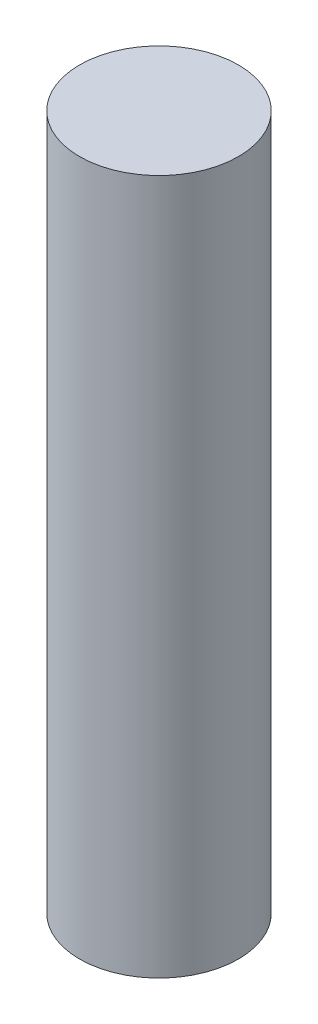
ISO-10303-21;
HEADER;
FILE_DESCRIPTION(('STEP AP214'),'2;1');
FILE_NAME('part.step','',(''),(''),'','','');
FILE_SCHEMA(('AUTOMOTIVE_DESIGN { 1 0 10303 214 1 1 1 1 }'));
ENDSEC;
DATA;
#1=APPLICATION_CONTEXT('core data for automotive mechanical design processes');
#2=APPLICATION_PROTOCOL_DEFINITION('international standard','automotive_design',2000,#1);
#3=PRODUCT_CONTEXT('',#1,'mechanical');
#4=PRODUCT('Part','Part','',(#3));
#5=PRODUCT_RELATED_PRODUCT_CATEGORY('part','',(#4));
#6=PRODUCT_DEFINITION_FORMATION('','',#4);
#7=PRODUCT_DEFINITION_CONTEXT('part definition',#1,'design');
#8=PRODUCT_DEFINITION('design','',#6,#7);
#9=PRODUCT_DEFINITION_SHAPE('','',#8);
#10=(LENGTH_UNIT() NAMED_UNIT(*) SI_UNIT(.MILLI.,.METRE.));
#11=(NAMED_UNIT(*) PLANE_ANGLE_UNIT() SI_UNIT($,.RADIAN.));
#12=(NAMED_UNIT(*) SI_UNIT($,.STERADIAN.) SOLID_ANGLE_UNIT());
#13=UNCERTAINTY_MEASURE_WITH_UNIT(LENGTH_MEASURE(1.E-05),#10,'distance_accuracy_value','');
#14=(GEOMETRIC_REPRESENTATION_CONTEXT(3) GLOBAL_UNCERTAINTY_ASSIGNED_CONTEXT((#13)) GLOBAL_UNIT_ASSIGNED_CONTEXT((#10,
#11,#12)) REPRESENTATION_CONTEXT('',''));
#15=CARTESIAN_POINT('',(0.,0.,0.));
#16=DIRECTION('',(0.,0.,1.));
#17=DIRECTION('',(1.,0.,0.));
#18=AXIS2_PLACEMENT_3D('',#15,#16,#17);
#19=CARTESIAN_POINT('',(0.,17.5,0.));
#20=DIRECTION('',(0.,-1.,0.));
#21=DIRECTION('',(0.,0.,-1.));
#22=AXIS2_PLACEMENT_3D('',#19,#20,#21);
#23=CYLINDRICAL_SURFACE('',#22,4.);
#24=CARTESIAN_POINT('',(0.,17.5,0.));
#25=DIRECTION('',(0.,1.,0.));
#26=DIRECTION('',(0.,0.,1.));
#27=AXIS2_PLACEMENT_3D('',#24,#25,#26);
#28=CIRCLE('',#27,4.);
#29=CARTESIAN_POINT('',(0.,17.5,4.));
#30=VERTEX_POINT('',#29);
#31=EDGE_CURVE('E10',#30,#30,#28,.T.);
#32=ORIENTED_EDGE('',*,*,#31,.F.);
#33=EDGE_LOOP('',(#32));
#34=FACE_BOUND('',#33,.T.);
#35=CARTESIAN_POINT('',(0.,-17.5,0.));
#36=DIRECTION('',(0.,1.,0.));
#37=DIRECTION('',(0.,0.,1.));
#38=AXIS2_PLACEMENT_3D('',#35,#36,#37);
#39=CIRCLE('',#38,4.);
#40=CARTESIAN_POINT('',(0.,-17.5,4.));
#41=VERTEX_POINT('',#40);
#42=EDGE_CURVE('E33',#41,#41,#39,.T.);
#43=ORIENTED_EDGE('',*,*,#42,.T.);
#44=EDGE_LOOP('',(#43));
#45=FACE_BOUND('',#44,.T.);
#46=ADVANCED_FACE('F30',(#34,#45),#23,.T.);
#47=CARTESIAN_POINT('',(0.,17.5,0.));
#48=DIRECTION('',(0.,1.,0.));
#49=DIRECTION('',(0.,0.,1.));
#50=AXIS2_PLACEMENT_3D('',#47,#48,#49);
#51=PLANE('',#50);
#52=ORIENTED_EDGE('',*,*,#31,.T.);
#53=EDGE_LOOP('',(#52));
#54=FACE_BOUND('',#53,.T.);
#55=ADVANCED_FACE('F45',(#54),#51,.T.);
#56=CARTESIAN_POINT('',(0.,-17.5,0.));
#57=DIRECTION('',(0.,1.,0.));
#58=DIRECTION('',(0.,0.,1.));
#59=AXIS2_PLACEMENT_3D('',#56,#57,#58);
#60=PLANE('',#59);
#61=ORIENTED_EDGE('',*,*,#42,.F.);
#62=EDGE_LOOP('',(#61));
#63=FACE_BOUND('',#62,.T.);
#64=ADVANCED_FACE('F43',(#63),#60,.F.);
#65=CLOSED_SHELL('',(#46,#55,#64));
#66=MANIFOLD_SOLID_BREP('B2',#65);
#67=ADVANCED_BREP_SHAPE_REPRESENTATION('',(#18,#66),#14);
#68=SHAPE_DEFINITION_REPRESENTATION(#9,#67);
ENDSEC;
END-ISO-10303-21;
